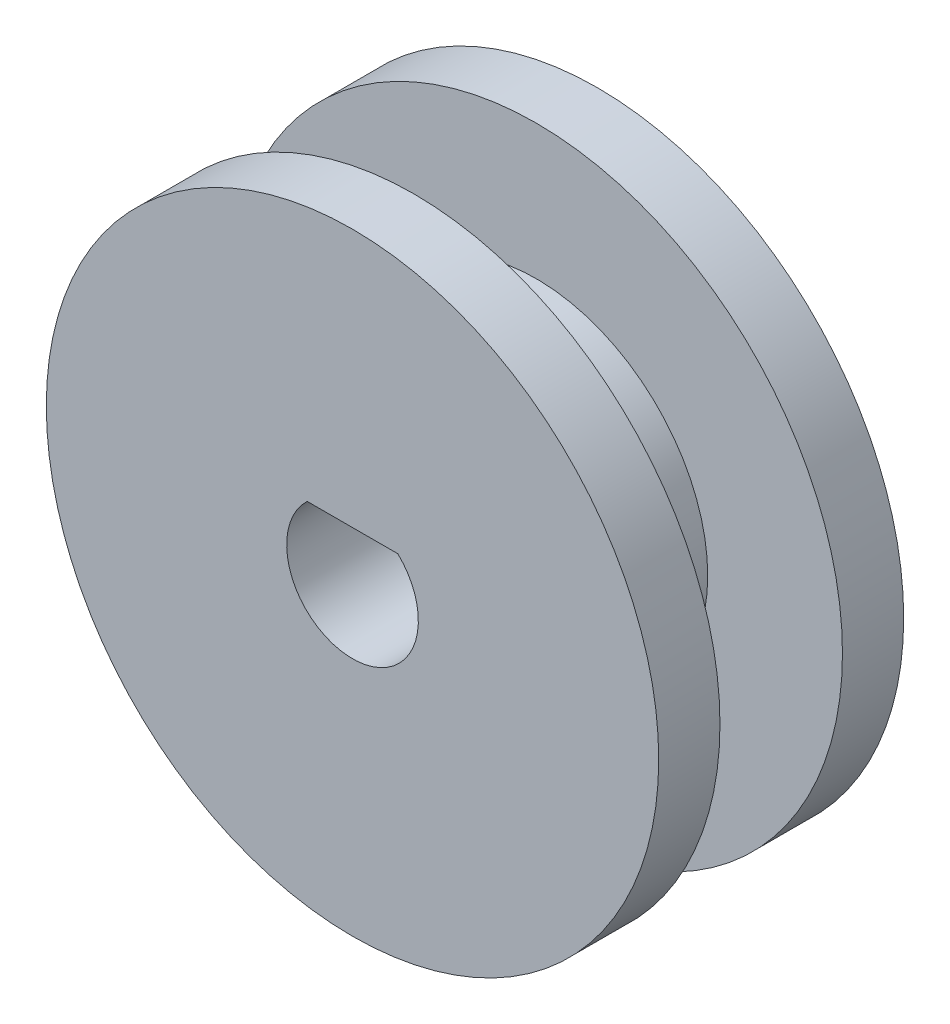
ISO-10303-21;
HEADER;
FILE_DESCRIPTION(('STEP AP214'),'2;1');
FILE_NAME('part.step','',(''),(''),'','','');
FILE_SCHEMA(('AUTOMOTIVE_DESIGN { 1 0 10303 214 1 1 1 1 }'));
ENDSEC;
DATA;
#1=APPLICATION_CONTEXT('core data for automotive mechanical design processes');
#2=APPLICATION_PROTOCOL_DEFINITION('international standard','automotive_design',2000,#1);
#3=PRODUCT_CONTEXT('',#1,'mechanical');
#4=PRODUCT('Part','Part','',(#3));
#5=PRODUCT_RELATED_PRODUCT_CATEGORY('part','',(#4));
#6=PRODUCT_DEFINITION_FORMATION('','',#4);
#7=PRODUCT_DEFINITION_CONTEXT('part definition',#1,'design');
#8=PRODUCT_DEFINITION('design','',#6,#7);
#9=PRODUCT_DEFINITION_SHAPE('','',#8);
#10=(LENGTH_UNIT() NAMED_UNIT(*) SI_UNIT(.MILLI.,.METRE.));
#11=(NAMED_UNIT(*) PLANE_ANGLE_UNIT() SI_UNIT($,.RADIAN.));
#12=(NAMED_UNIT(*) SI_UNIT($,.STERADIAN.) SOLID_ANGLE_UNIT());
#13=UNCERTAINTY_MEASURE_WITH_UNIT(LENGTH_MEASURE(1.E-05),#10,'distance_accuracy_value','');
#14=(GEOMETRIC_REPRESENTATION_CONTEXT(3) GLOBAL_UNCERTAINTY_ASSIGNED_CONTEXT((#13)) GLOBAL_UNIT_ASSIGNED_CONTEXT((#10,
#11,#12)) REPRESENTATION_CONTEXT('',''));
#15=CARTESIAN_POINT('',(0.,0.,0.));
#16=DIRECTION('',(0.,0.,1.));
#17=DIRECTION('',(1.,0.,0.));
#18=AXIS2_PLACEMENT_3D('',#15,#16,#17);
#19=CARTESIAN_POINT('',(0.,0.,0.));
#20=DIRECTION('',(0.,0.,1.));
#21=DIRECTION('',(1.,0.,0.));
#22=AXIS2_PLACEMENT_3D('',#19,#20,#21);
#23=PLANE('',#22);
#24=CARTESIAN_POINT('',(0.,0.,0.));
#25=DIRECTION('',(0.,0.,1.));
#26=DIRECTION('',(1.,0.,0.));
#27=AXIS2_PLACEMENT_3D('',#24,#25,#26);
#28=CIRCLE('',#27,10.);
#29=CARTESIAN_POINT('',(10.,0.,0.));
#30=VERTEX_POINT('',#29);
#31=EDGE_CURVE('E36',#30,#30,#28,.T.);
#32=ORIENTED_EDGE('',*,*,#31,.F.);
#33=EDGE_LOOP('',(#32));
#34=FACE_BOUND('',#33,.T.);
#35=DIRECTION('',(1.,0.,0.));
#36=VECTOR('',#35,1.);
#37=CARTESIAN_POINT('',(0.,1.56,0.));
#38=LINE('',#37,#36);
#39=CARTESIAN_POINT('',(-1.47949315645595,1.56,0.));
#40=VERTEX_POINT('',#39);
#41=CARTESIAN_POINT('',(1.47949315645595,1.56,0.));
#42=VERTEX_POINT('',#41);
#43=EDGE_CURVE('E63',#40,#42,#38,.T.);
#44=ORIENTED_EDGE('',*,*,#43,.F.);
#45=CARTESIAN_POINT('',(0.,0.,0.));
#46=DIRECTION('',(0.,0.,1.));
#47=DIRECTION('',(1.,0.,0.));
#48=AXIS2_PLACEMENT_3D('',#45,#46,#47);
#49=CIRCLE('',#48,2.15);
#50=EDGE_CURVE('E76',#40,#42,#49,.T.);
#51=ORIENTED_EDGE('',*,*,#50,.T.);
#52=EDGE_LOOP('',(#44,#51));
#53=FACE_BOUND('',#52,.T.);
#54=ADVANCED_FACE('F32',(#34,#53),#23,.F.);
#55=CARTESIAN_POINT('',(0.,0.,8.));
#56=DIRECTION('',(0.,0.,1.));
#57=DIRECTION('',(1.,0.,0.));
#58=AXIS2_PLACEMENT_3D('',#55,#56,#57);
#59=PLANE('',#58);
#60=CARTESIAN_POINT('',(0.,0.,8.));
#61=DIRECTION('',(0.,0.,1.));
#62=DIRECTION('',(1.,0.,0.));
#63=AXIS2_PLACEMENT_3D('',#60,#61,#62);
#64=CIRCLE('',#63,10.);
#65=CARTESIAN_POINT('',(10.,0.,8.));
#66=VERTEX_POINT('',#65);
#67=EDGE_CURVE('E80',#66,#66,#64,.T.);
#68=ORIENTED_EDGE('',*,*,#67,.T.);
#69=EDGE_LOOP('',(#68));
#70=FACE_BOUND('',#69,.T.);
#71=CARTESIAN_POINT('',(0.,0.,8.));
#72=DIRECTION('',(0.,0.,1.));
#73=DIRECTION('',(1.,0.,0.));
#74=AXIS2_PLACEMENT_3D('',#71,#72,#73);
#75=CIRCLE('',#74,2.15);
#76=CARTESIAN_POINT('',(-1.47949315645595,1.56,8.));
#77=VERTEX_POINT('',#76);
#78=CARTESIAN_POINT('',(1.47949315645595,1.56,8.));
#79=VERTEX_POINT('',#78);
#80=EDGE_CURVE('E69',#77,#79,#75,.T.);
#81=ORIENTED_EDGE('',*,*,#80,.F.);
#82=DIRECTION('',(1.,0.,0.));
#83=VECTOR('',#82,1.);
#84=CARTESIAN_POINT('',(0.,1.56,8.));
#85=LINE('',#84,#83);
#86=EDGE_CURVE('E56',#77,#79,#85,.T.);
#87=ORIENTED_EDGE('',*,*,#86,.T.);
#88=EDGE_LOOP('',(#81,#87));
#89=FACE_BOUND('',#88,.T.);
#90=ADVANCED_FACE('F73',(#70,#89),#59,.T.);
#91=CARTESIAN_POINT('',(0.,0.,2.));
#92=DIRECTION('',(0.,0.,-1.));
#93=DIRECTION('',(-1.,0.,0.));
#94=AXIS2_PLACEMENT_3D('',#91,#92,#93);
#95=CYLINDRICAL_SURFACE('',#94,10.);
#96=CARTESIAN_POINT('',(0.,0.,2.));
#97=DIRECTION('',(0.,0.,1.));
#98=DIRECTION('',(1.,0.,0.));
#99=AXIS2_PLACEMENT_3D('',#96,#97,#98);
#100=CIRCLE('',#99,10.);
#101=CARTESIAN_POINT('',(10.,0.,2.));
#102=VERTEX_POINT('',#101);
#103=EDGE_CURVE('E41',#102,#102,#100,.T.);
#104=ORIENTED_EDGE('',*,*,#103,.F.);
#105=EDGE_LOOP('',(#104));
#106=FACE_BOUND('',#105,.T.);
#107=ORIENTED_EDGE('',*,*,#31,.T.);
#108=EDGE_LOOP('',(#107));
#109=FACE_BOUND('',#108,.T.);
#110=ADVANCED_FACE('F34',(#106,#109),#95,.T.);
#111=CARTESIAN_POINT('',(0.,0.,2.));
#112=DIRECTION('',(0.,0.,1.));
#113=DIRECTION('',(1.,0.,0.));
#114=AXIS2_PLACEMENT_3D('',#111,#112,#113);
#115=PLANE('',#114);
#116=CARTESIAN_POINT('',(0.,0.,2.));
#117=DIRECTION('',(0.,0.,1.));
#118=DIRECTION('',(1.,0.,0.));
#119=AXIS2_PLACEMENT_3D('',#116,#117,#118);
#120=CIRCLE('',#119,5.6);
#121=CARTESIAN_POINT('',(5.6,0.,2.));
#122=VERTEX_POINT('',#121);
#123=EDGE_CURVE('E11',#122,#122,#120,.T.);
#124=ORIENTED_EDGE('',*,*,#123,.F.);
#125=EDGE_LOOP('',(#124));
#126=FACE_BOUND('',#125,.T.);
#127=ORIENTED_EDGE('',*,*,#103,.T.);
#128=EDGE_LOOP('',(#127));
#129=FACE_BOUND('',#128,.T.);
#130=ADVANCED_FACE('F102',(#126,#129),#115,.T.);
#131=CARTESIAN_POINT('',(0.,0.,6.));
#132=DIRECTION('',(0.,0.,-1.));
#133=DIRECTION('',(-1.,0.,0.));
#134=AXIS2_PLACEMENT_3D('',#131,#132,#133);
#135=CYLINDRICAL_SURFACE('',#134,5.6);
#136=CARTESIAN_POINT('',(0.,0.,6.));
#137=DIRECTION('',(0.,0.,1.));
#138=DIRECTION('',(1.,0.,0.));
#139=AXIS2_PLACEMENT_3D('',#136,#137,#138);
#140=CIRCLE('',#139,5.6);
#141=CARTESIAN_POINT('',(5.6,0.,6.));
#142=VERTEX_POINT('',#141);
#143=EDGE_CURVE('E83',#142,#142,#140,.T.);
#144=ORIENTED_EDGE('',*,*,#143,.F.);
#145=EDGE_LOOP('',(#144));
#146=FACE_BOUND('',#145,.T.);
#147=ORIENTED_EDGE('',*,*,#123,.T.);
#148=EDGE_LOOP('',(#147));
#149=FACE_BOUND('',#148,.T.);
#150=ADVANCED_FACE('F105',(#146,#149),#135,.T.);
#151=CARTESIAN_POINT('',(0.,0.,8.));
#152=DIRECTION('',(0.,0.,-1.));
#153=DIRECTION('',(-1.,0.,0.));
#154=AXIS2_PLACEMENT_3D('',#151,#152,#153);
#155=CYLINDRICAL_SURFACE('',#154,10.);
#156=ORIENTED_EDGE('',*,*,#67,.F.);
#157=EDGE_LOOP('',(#156));
#158=FACE_BOUND('',#157,.T.);
#159=CARTESIAN_POINT('',(0.,0.,6.));
#160=DIRECTION('',(0.,0.,1.));
#161=DIRECTION('',(1.,0.,0.));
#162=AXIS2_PLACEMENT_3D('',#159,#160,#161);
#163=CIRCLE('',#162,10.);
#164=CARTESIAN_POINT('',(10.,0.,6.));
#165=VERTEX_POINT('',#164);
#166=EDGE_CURVE('E65',#165,#165,#163,.T.);
#167=ORIENTED_EDGE('',*,*,#166,.T.);
#168=EDGE_LOOP('',(#167));
#169=FACE_BOUND('',#168,.T.);
#170=ADVANCED_FACE('F109',(#158,#169),#155,.T.);
#171=CARTESIAN_POINT('',(0.,0.,6.));
#172=DIRECTION('',(0.,0.,1.));
#173=DIRECTION('',(1.,0.,0.));
#174=AXIS2_PLACEMENT_3D('',#171,#172,#173);
#175=PLANE('',#174);
#176=ORIENTED_EDGE('',*,*,#143,.T.);
#177=EDGE_LOOP('',(#176));
#178=FACE_BOUND('',#177,.T.);
#179=ORIENTED_EDGE('',*,*,#166,.F.);
#180=EDGE_LOOP('',(#179));
#181=FACE_BOUND('',#180,.T.);
#182=ADVANCED_FACE('F113',(#178,#181),#175,.F.);
#183=CARTESIAN_POINT('',(0.,1.56,0.));
#184=DIRECTION('',(0.,-1.,0.));
#185=DIRECTION('',(0.,0.,-1.));
#186=AXIS2_PLACEMENT_3D('',#183,#184,#185);
#187=PLANE('',#186);
#188=ORIENTED_EDGE('',*,*,#86,.F.);
#189=DIRECTION('',(0.,0.,1.));
#190=VECTOR('',#189,1.);
#191=CARTESIAN_POINT('',(-1.47949315645595,1.56,0.));
#192=LINE('',#191,#190);
#193=EDGE_CURVE('E66',#40,#77,#192,.T.);
#194=ORIENTED_EDGE('',*,*,#193,.F.);
#195=ORIENTED_EDGE('',*,*,#43,.T.);
#196=DIRECTION('',(0.,0.,1.));
#197=VECTOR('',#196,1.);
#198=CARTESIAN_POINT('',(1.47949315645595,1.56,0.));
#199=LINE('',#198,#197);
#200=EDGE_CURVE('E49',#42,#79,#199,.T.);
#201=ORIENTED_EDGE('',*,*,#200,.T.);
#202=EDGE_LOOP('',(#188,#194,#195,#201));
#203=FACE_BOUND('',#202,.T.);
#204=ADVANCED_FACE('F61',(#203),#187,.T.);
#205=CARTESIAN_POINT('',(0.,0.,0.));
#206=DIRECTION('',(0.,0.,1.));
#207=DIRECTION('',(1.,0.,0.));
#208=AXIS2_PLACEMENT_3D('',#205,#206,#207);
#209=CYLINDRICAL_SURFACE('',#208,2.15);
#210=ORIENTED_EDGE('',*,*,#80,.T.);
#211=ORIENTED_EDGE('',*,*,#200,.F.);
#212=ORIENTED_EDGE('',*,*,#50,.F.);
#213=ORIENTED_EDGE('',*,*,#193,.T.);
#214=EDGE_LOOP('',(#210,#211,#212,#213));
#215=FACE_BOUND('',#214,.T.);
#216=ADVANCED_FACE('F70',(#215),#209,.F.);
#217=CLOSED_SHELL('',(#54,#90,#110,#130,#150,#170,#182,#204,#216));
#218=MANIFOLD_SOLID_BREP('B2',#217);
#219=ADVANCED_BREP_SHAPE_REPRESENTATION('',(#18,#218),#14);
#220=SHAPE_DEFINITION_REPRESENTATION(#9,#219);
ENDSEC;
END-ISO-10303-21;
